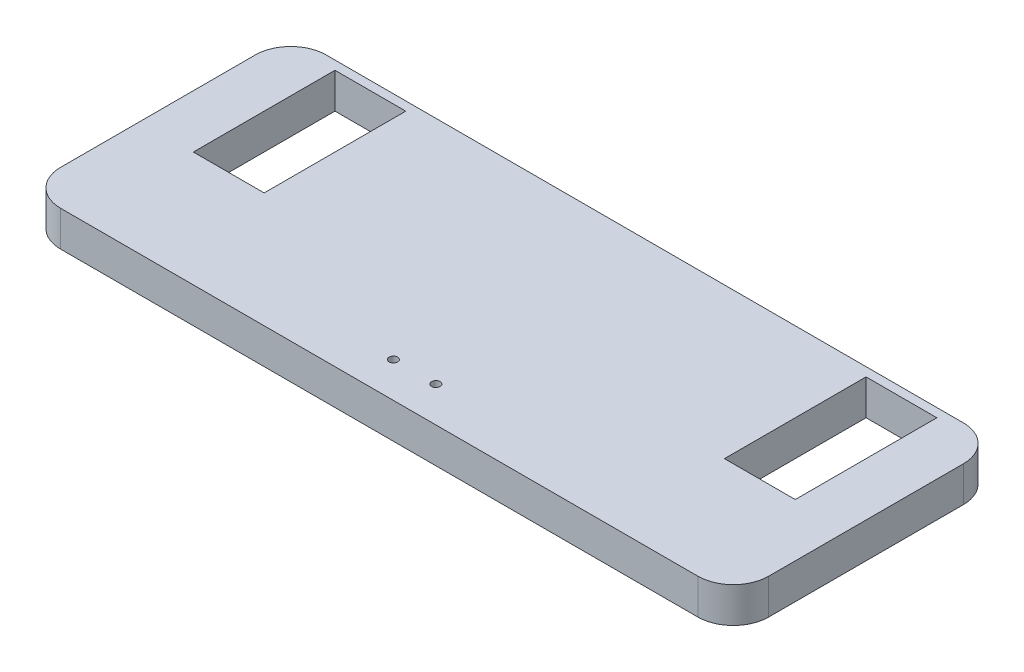
ISO-10303-21;
HEADER;
FILE_DESCRIPTION(('STEP AP214'),'2;1');
FILE_NAME('part.step','',(''),(''),'','','');
FILE_SCHEMA(('AUTOMOTIVE_DESIGN { 1 0 10303 214 1 1 1 1 }'));
ENDSEC;
DATA;
#1=APPLICATION_CONTEXT('core data for automotive mechanical design processes');
#2=APPLICATION_PROTOCOL_DEFINITION('international standard','automotive_design',2000,#1);
#3=PRODUCT_CONTEXT('',#1,'mechanical');
#4=PRODUCT('Part','Part','',(#3));
#5=PRODUCT_RELATED_PRODUCT_CATEGORY('part','',(#4));
#6=PRODUCT_DEFINITION_FORMATION('','',#4);
#7=PRODUCT_DEFINITION_CONTEXT('part definition',#1,'design');
#8=PRODUCT_DEFINITION('design','',#6,#7);
#9=PRODUCT_DEFINITION_SHAPE('','',#8);
#10=(LENGTH_UNIT() NAMED_UNIT(*) SI_UNIT(.MILLI.,.METRE.));
#11=(NAMED_UNIT(*) PLANE_ANGLE_UNIT() SI_UNIT($,.RADIAN.));
#12=(NAMED_UNIT(*) SI_UNIT($,.STERADIAN.) SOLID_ANGLE_UNIT());
#13=UNCERTAINTY_MEASURE_WITH_UNIT(LENGTH_MEASURE(1.E-05),#10,'distance_accuracy_value','');
#14=(GEOMETRIC_REPRESENTATION_CONTEXT(3) GLOBAL_UNCERTAINTY_ASSIGNED_CONTEXT((#13)) GLOBAL_UNIT_ASSIGNED_CONTEXT((#10,
#11,#12)) REPRESENTATION_CONTEXT('',''));
#15=CARTESIAN_POINT('',(0.,0.,0.));
#16=DIRECTION('',(0.,0.,1.));
#17=DIRECTION('',(1.,0.,0.));
#18=AXIS2_PLACEMENT_3D('',#15,#16,#17);
#19=CARTESIAN_POINT('',(0.,10.,0.));
#20=DIRECTION('',(1.,0.,0.));
#21=DIRECTION('',(0.,0.,-1.));
#22=AXIS2_PLACEMENT_3D('',#19,#20,#21);
#23=PLANE('',#22);
#24=DIRECTION('',(0.,0.,1.));
#25=VECTOR('',#24,1.);
#26=CARTESIAN_POINT('',(0.,0.,0.));
#27=LINE('',#26,#25);
#28=CARTESIAN_POINT('',(0.,0.,-65.));
#29=VERTEX_POINT('',#28);
#30=CARTESIAN_POINT('',(0.,0.,-10.));
#31=VERTEX_POINT('',#30);
#32=EDGE_CURVE('E242',#29,#31,#27,.T.);
#33=ORIENTED_EDGE('',*,*,#32,.T.);
#34=DIRECTION('',(0.,-1.,0.));
#35=VECTOR('',#34,1.);
#36=CARTESIAN_POINT('',(0.,10.,-10.));
#37=LINE('',#36,#35);
#38=CARTESIAN_POINT('',(0.,10.,-10.));
#39=VERTEX_POINT('',#38);
#40=EDGE_CURVE('E317',#31,#39,#37,.F.);
#41=ORIENTED_EDGE('',*,*,#40,.T.);
#42=DIRECTION('',(0.,0.,1.));
#43=VECTOR('',#42,1.);
#44=CARTESIAN_POINT('',(0.,10.,0.));
#45=LINE('',#44,#43);
#46=CARTESIAN_POINT('',(0.,10.,-65.));
#47=VERTEX_POINT('',#46);
#48=EDGE_CURVE('E278',#47,#39,#45,.T.);
#49=ORIENTED_EDGE('',*,*,#48,.F.);
#50=DIRECTION('',(0.,-1.,0.));
#51=VECTOR('',#50,1.);
#52=CARTESIAN_POINT('',(0.,10.,-65.));
#53=LINE('',#52,#51);
#54=EDGE_CURVE('E314',#47,#29,#53,.T.);
#55=ORIENTED_EDGE('',*,*,#54,.T.);
#56=EDGE_LOOP('',(#33,#41,#49,#55));
#57=FACE_BOUND('',#56,.T.);
#58=ADVANCED_FACE('F37',(#57),#23,.F.);
#59=CARTESIAN_POINT('',(0.,10.,0.));
#60=DIRECTION('',(0.,0.,-1.));
#61=DIRECTION('',(-1.,0.,0.));
#62=AXIS2_PLACEMENT_3D('',#59,#60,#61);
#63=PLANE('',#62);
#64=DIRECTION('',(1.,0.,0.));
#65=VECTOR('',#64,1.);
#66=CARTESIAN_POINT('',(0.,10.,0.));
#67=LINE('',#66,#65);
#68=CARTESIAN_POINT('',(10.,10.,0.));
#69=VERTEX_POINT('',#68);
#70=CARTESIAN_POINT('',(190.,10.,0.));
#71=VERTEX_POINT('',#70);
#72=EDGE_CURVE('E281',#69,#71,#67,.T.);
#73=ORIENTED_EDGE('',*,*,#72,.F.);
#74=DIRECTION('',(0.,-1.,0.));
#75=VECTOR('',#74,1.);
#76=CARTESIAN_POINT('',(10.,10.,0.));
#77=LINE('',#76,#75);
#78=CARTESIAN_POINT('',(10.,0.,0.));
#79=VERTEX_POINT('',#78);
#80=EDGE_CURVE('E303',#69,#79,#77,.T.);
#81=ORIENTED_EDGE('',*,*,#80,.T.);
#82=DIRECTION('',(1.,0.,0.));
#83=VECTOR('',#82,1.);
#84=CARTESIAN_POINT('',(0.,0.,0.));
#85=LINE('',#84,#83);
#86=CARTESIAN_POINT('',(190.,0.,0.));
#87=VERTEX_POINT('',#86);
#88=EDGE_CURVE('E294',#79,#87,#85,.T.);
#89=ORIENTED_EDGE('',*,*,#88,.T.);
#90=DIRECTION('',(0.,-1.,0.));
#91=VECTOR('',#90,1.);
#92=CARTESIAN_POINT('',(190.,10.,0.));
#93=LINE('',#92,#91);
#94=EDGE_CURVE('E291',#87,#71,#93,.F.);
#95=ORIENTED_EDGE('',*,*,#94,.T.);
#96=EDGE_LOOP('',(#73,#81,#89,#95));
#97=FACE_BOUND('',#96,.T.);
#98=ADVANCED_FACE('F356',(#97),#63,.F.);
#99=CARTESIAN_POINT('',(200.,10.,0.));
#100=DIRECTION('',(-1.,0.,0.));
#101=DIRECTION('',(0.,0.,1.));
#102=AXIS2_PLACEMENT_3D('',#99,#100,#101);
#103=PLANE('',#102);
#104=DIRECTION('',(0.,0.,-1.));
#105=VECTOR('',#104,1.);
#106=CARTESIAN_POINT('',(200.,10.,0.));
#107=LINE('',#106,#105);
#108=CARTESIAN_POINT('',(200.,10.,-10.));
#109=VERTEX_POINT('',#108);
#110=CARTESIAN_POINT('',(200.,10.,-65.));
#111=VERTEX_POINT('',#110);
#112=EDGE_CURVE('E285',#109,#111,#107,.T.);
#113=ORIENTED_EDGE('',*,*,#112,.F.);
#114=DIRECTION('',(0.,-1.,0.));
#115=VECTOR('',#114,1.);
#116=CARTESIAN_POINT('',(200.,10.,-10.));
#117=LINE('',#116,#115);
#118=CARTESIAN_POINT('',(200.,0.,-10.));
#119=VERTEX_POINT('',#118);
#120=EDGE_CURVE('E329',#109,#119,#117,.T.);
#121=ORIENTED_EDGE('',*,*,#120,.T.);
#122=DIRECTION('',(0.,0.,-1.));
#123=VECTOR('',#122,1.);
#124=CARTESIAN_POINT('',(200.,0.,0.));
#125=LINE('',#124,#123);
#126=CARTESIAN_POINT('',(200.,0.,-65.));
#127=VERTEX_POINT('',#126);
#128=EDGE_CURVE('E297',#119,#127,#125,.T.);
#129=ORIENTED_EDGE('',*,*,#128,.T.);
#130=DIRECTION('',(0.,-1.,0.));
#131=VECTOR('',#130,1.);
#132=CARTESIAN_POINT('',(200.,10.,-65.));
#133=LINE('',#132,#131);
#134=EDGE_CURVE('E327',#127,#111,#133,.F.);
#135=ORIENTED_EDGE('',*,*,#134,.T.);
#136=EDGE_LOOP('',(#113,#121,#129,#135));
#137=FACE_BOUND('',#136,.T.);
#138=ADVANCED_FACE('F365',(#137),#103,.F.);
#139=CARTESIAN_POINT('',(0.,10.,-75.));
#140=DIRECTION('',(0.,0.,1.));
#141=DIRECTION('',(1.,0.,0.));
#142=AXIS2_PLACEMENT_3D('',#139,#140,#141);
#143=PLANE('',#142);
#144=DIRECTION('',(-1.,0.,0.));
#145=VECTOR('',#144,1.);
#146=CARTESIAN_POINT('',(0.,10.,-75.));
#147=LINE('',#146,#145);
#148=CARTESIAN_POINT('',(190.,10.,-75.));
#149=VERTEX_POINT('',#148);
#150=CARTESIAN_POINT('',(10.,10.,-75.));
#151=VERTEX_POINT('',#150);
#152=EDGE_CURVE('E288',#149,#151,#147,.T.);
#153=ORIENTED_EDGE('',*,*,#152,.F.);
#154=DIRECTION('',(0.,-1.,0.));
#155=VECTOR('',#154,1.);
#156=CARTESIAN_POINT('',(190.,10.,-75.));
#157=LINE('',#156,#155);
#158=CARTESIAN_POINT('',(190.,0.,-75.));
#159=VERTEX_POINT('',#158);
#160=EDGE_CURVE('E12',#149,#159,#157,.T.);
#161=ORIENTED_EDGE('',*,*,#160,.T.);
#162=DIRECTION('',(-1.,0.,0.));
#163=VECTOR('',#162,1.);
#164=CARTESIAN_POINT('',(0.,0.,-75.));
#165=LINE('',#164,#163);
#166=CARTESIAN_POINT('',(10.,0.,-75.));
#167=VERTEX_POINT('',#166);
#168=EDGE_CURVE('E282',#159,#167,#165,.T.);
#169=ORIENTED_EDGE('',*,*,#168,.T.);
#170=DIRECTION('',(0.,-1.,0.));
#171=VECTOR('',#170,1.);
#172=CARTESIAN_POINT('',(10.,10.,-75.));
#173=LINE('',#172,#171);
#174=EDGE_CURVE('E45',#167,#151,#173,.F.);
#175=ORIENTED_EDGE('',*,*,#174,.T.);
#176=EDGE_LOOP('',(#153,#161,#169,#175));
#177=FACE_BOUND('',#176,.T.);
#178=ADVANCED_FACE('F334',(#177),#143,.F.);
#179=CARTESIAN_POINT('',(0.,10.,0.));
#180=DIRECTION('',(0.,-1.,0.));
#181=DIRECTION('',(0.,0.,-1.));
#182=AXIS2_PLACEMENT_3D('',#179,#180,#181);
#183=PLANE('',#182);
#184=CARTESIAN_POINT('',(106.,10.,-9.99999999999999));
#185=DIRECTION('',(0.,-1.,0.));
#186=DIRECTION('',(0.,0.,-1.));
#187=AXIS2_PLACEMENT_3D('',#184,#185,#186);
#188=CIRCLE('',#187,1.19999999999999);
#189=CARTESIAN_POINT('',(106.,10.,-11.2));
#190=VERTEX_POINT('',#189);
#191=EDGE_CURVE('E605',#190,#190,#188,.T.);
#192=ORIENTED_EDGE('',*,*,#191,.T.);
#193=EDGE_LOOP('',(#192));
#194=FACE_BOUND('',#193,.T.);
#195=CARTESIAN_POINT('',(94.,10.,-9.99999999999999));
#196=DIRECTION('',(0.,-1.,0.));
#197=DIRECTION('',(0.,0.,-1.));
#198=AXIS2_PLACEMENT_3D('',#195,#196,#197);
#199=CIRCLE('',#198,1.19999999999999);
#200=CARTESIAN_POINT('',(94.,10.,-11.2));
#201=VERTEX_POINT('',#200);
#202=EDGE_CURVE('E200',#201,#201,#199,.T.);
#203=ORIENTED_EDGE('',*,*,#202,.T.);
#204=EDGE_LOOP('',(#203));
#205=FACE_BOUND('',#204,.T.);
#206=DIRECTION('',(1.,0.,0.));
#207=VECTOR('',#206,1.);
#208=CARTESIAN_POINT('',(15.,10.,-32.5));
#209=LINE('',#208,#207);
#210=CARTESIAN_POINT('',(15.,10.,-32.5));
#211=VERTEX_POINT('',#210);
#212=CARTESIAN_POINT('',(35.,10.,-32.5));
#213=VERTEX_POINT('',#212);
#214=EDGE_CURVE('E231',#211,#213,#209,.T.);
#215=ORIENTED_EDGE('',*,*,#214,.F.);
#216=DIRECTION('',(0.,0.,1.));
#217=VECTOR('',#216,1.);
#218=CARTESIAN_POINT('',(15.,10.,-32.5));
#219=LINE('',#218,#217);
#220=CARTESIAN_POINT('',(15.,10.,-72.5));
#221=VERTEX_POINT('',#220);
#222=EDGE_CURVE('E60',#221,#211,#219,.T.);
#223=ORIENTED_EDGE('',*,*,#222,.F.);
#224=DIRECTION('',(-1.,0.,0.));
#225=VECTOR('',#224,1.);
#226=CARTESIAN_POINT('',(15.,10.,-72.5));
#227=LINE('',#226,#225);
#228=CARTESIAN_POINT('',(35.,10.,-72.5));
#229=VERTEX_POINT('',#228);
#230=EDGE_CURVE('E220',#229,#221,#227,.T.);
#231=ORIENTED_EDGE('',*,*,#230,.F.);
#232=DIRECTION('',(0.,0.,-1.));
#233=VECTOR('',#232,1.);
#234=CARTESIAN_POINT('',(35.,10.,-32.5));
#235=LINE('',#234,#233);
#236=EDGE_CURVE('E235',#213,#229,#235,.T.);
#237=ORIENTED_EDGE('',*,*,#236,.F.);
#238=EDGE_LOOP('',(#215,#223,#231,#237));
#239=FACE_BOUND('',#238,.T.);
#240=DIRECTION('',(0.,0.,-1.));
#241=VECTOR('',#240,1.);
#242=CARTESIAN_POINT('',(185.,10.,-32.5));
#243=LINE('',#242,#241);
#244=CARTESIAN_POINT('',(185.,10.,-32.5));
#245=VERTEX_POINT('',#244);
#246=CARTESIAN_POINT('',(185.,10.,-72.5));
#247=VERTEX_POINT('',#246);
#248=EDGE_CURVE('E263',#245,#247,#243,.T.);
#249=ORIENTED_EDGE('',*,*,#248,.F.);
#250=DIRECTION('',(1.,0.,0.));
#251=VECTOR('',#250,1.);
#252=CARTESIAN_POINT('',(185.,10.,-32.5));
#253=LINE('',#252,#251);
#254=CARTESIAN_POINT('',(165.,10.,-32.5));
#255=VERTEX_POINT('',#254);
#256=EDGE_CURVE('E212',#255,#245,#253,.T.);
#257=ORIENTED_EDGE('',*,*,#256,.F.);
#258=DIRECTION('',(0.,0.,1.));
#259=VECTOR('',#258,1.);
#260=CARTESIAN_POINT('',(165.,10.,-32.5));
#261=LINE('',#260,#259);
#262=CARTESIAN_POINT('',(165.,10.,-72.5));
#263=VERTEX_POINT('',#262);
#264=EDGE_CURVE('E252',#263,#255,#261,.T.);
#265=ORIENTED_EDGE('',*,*,#264,.F.);
#266=DIRECTION('',(-1.,0.,0.));
#267=VECTOR('',#266,1.);
#268=CARTESIAN_POINT('',(185.,10.,-72.5));
#269=LINE('',#268,#267);
#270=EDGE_CURVE('E266',#247,#263,#269,.T.);
#271=ORIENTED_EDGE('',*,*,#270,.F.);
#272=EDGE_LOOP('',(#249,#257,#265,#271));
#273=FACE_BOUND('',#272,.T.);
#274=ORIENTED_EDGE('',*,*,#48,.T.);
#275=CARTESIAN_POINT('',(10.,10.,-10.));
#276=DIRECTION('',(0.,-1.,0.));
#277=DIRECTION('',(0.,0.,-1.));
#278=AXIS2_PLACEMENT_3D('',#275,#276,#277);
#279=CIRCLE('',#278,10.);
#280=EDGE_CURVE('E325',#39,#69,#279,.F.);
#281=ORIENTED_EDGE('',*,*,#280,.T.);
#282=ORIENTED_EDGE('',*,*,#72,.T.);
#283=CARTESIAN_POINT('',(190.,10.,-10.));
#284=DIRECTION('',(0.,-1.,0.));
#285=DIRECTION('',(0.,0.,-1.));
#286=AXIS2_PLACEMENT_3D('',#283,#284,#285);
#287=CIRCLE('',#286,10.);
#288=EDGE_CURVE('E323',#71,#109,#287,.F.);
#289=ORIENTED_EDGE('',*,*,#288,.T.);
#290=ORIENTED_EDGE('',*,*,#112,.T.);
#291=CARTESIAN_POINT('',(190.,10.,-65.));
#292=DIRECTION('',(0.,-1.,0.));
#293=DIRECTION('',(0.,0.,-1.));
#294=AXIS2_PLACEMENT_3D('',#291,#292,#293);
#295=CIRCLE('',#294,10.);
#296=EDGE_CURVE('E321',#111,#149,#295,.F.);
#297=ORIENTED_EDGE('',*,*,#296,.T.);
#298=ORIENTED_EDGE('',*,*,#152,.T.);
#299=CARTESIAN_POINT('',(10.,10.,-65.));
#300=DIRECTION('',(0.,-1.,0.));
#301=DIRECTION('',(0.,0.,-1.));
#302=AXIS2_PLACEMENT_3D('',#299,#300,#301);
#303=CIRCLE('',#302,10.);
#304=EDGE_CURVE('E319',#151,#47,#303,.F.);
#305=ORIENTED_EDGE('',*,*,#304,.T.);
#306=EDGE_LOOP('',(#274,#281,#282,#289,#290,#297,#298,#305));
#307=FACE_BOUND('',#306,.T.);
#308=ADVANCED_FACE('F340',(#194,#205,#239,#273,#307),#183,.F.);
#309=CARTESIAN_POINT('',(0.,0.,0.));
#310=DIRECTION('',(0.,-1.,0.));
#311=DIRECTION('',(0.,0.,-1.));
#312=AXIS2_PLACEMENT_3D('',#309,#310,#311);
#313=PLANE('',#312);
#314=DIRECTION('',(0.,0.,1.));
#315=VECTOR('',#314,1.);
#316=CARTESIAN_POINT('',(110.,0.,-4.99999999999999));
#317=LINE('',#316,#315);
#318=CARTESIAN_POINT('',(110.,0.,-15.));
#319=VERTEX_POINT('',#318);
#320=CARTESIAN_POINT('',(110.,0.,-4.99999999999999));
#321=VERTEX_POINT('',#320);
#322=EDGE_CURVE('E52',#319,#321,#317,.T.);
#323=ORIENTED_EDGE('',*,*,#322,.F.);
#324=DIRECTION('',(1.,0.,0.));
#325=VECTOR('',#324,1.);
#326=CARTESIAN_POINT('',(110.,0.,-15.));
#327=LINE('',#326,#325);
#328=CARTESIAN_POINT('',(90.,0.,-15.));
#329=VERTEX_POINT('',#328);
#330=EDGE_CURVE('E194',#329,#319,#327,.T.);
#331=ORIENTED_EDGE('',*,*,#330,.F.);
#332=DIRECTION('',(0.,0.,-1.));
#333=VECTOR('',#332,1.);
#334=CARTESIAN_POINT('',(90.,0.,-4.99999999999999));
#335=LINE('',#334,#333);
#336=CARTESIAN_POINT('',(90.,0.,-4.99999999999999));
#337=VERTEX_POINT('',#336);
#338=EDGE_CURVE('E197',#337,#329,#335,.T.);
#339=ORIENTED_EDGE('',*,*,#338,.F.);
#340=DIRECTION('',(-1.,0.,0.));
#341=VECTOR('',#340,1.);
#342=CARTESIAN_POINT('',(110.,0.,-4.99999999999999));
#343=LINE('',#342,#341);
#344=EDGE_CURVE('E206',#321,#337,#343,.T.);
#345=ORIENTED_EDGE('',*,*,#344,.F.);
#346=EDGE_LOOP('',(#323,#331,#339,#345));
#347=FACE_BOUND('',#346,.T.);
#348=DIRECTION('',(0.,0.,1.));
#349=VECTOR('',#348,1.);
#350=CARTESIAN_POINT('',(15.,0.,-32.5));
#351=LINE('',#350,#349);
#352=CARTESIAN_POINT('',(15.,0.,-72.5));
#353=VERTEX_POINT('',#352);
#354=CARTESIAN_POINT('',(15.,0.,-32.5));
#355=VERTEX_POINT('',#354);
#356=EDGE_CURVE('E216',#353,#355,#351,.T.);
#357=ORIENTED_EDGE('',*,*,#356,.T.);
#358=DIRECTION('',(1.,0.,0.));
#359=VECTOR('',#358,1.);
#360=CARTESIAN_POINT('',(15.,0.,-32.5));
#361=LINE('',#360,#359);
#362=CARTESIAN_POINT('',(35.,0.,-32.5));
#363=VERTEX_POINT('',#362);
#364=EDGE_CURVE('E219',#355,#363,#361,.T.);
#365=ORIENTED_EDGE('',*,*,#364,.T.);
#366=DIRECTION('',(0.,0.,-1.));
#367=VECTOR('',#366,1.);
#368=CARTESIAN_POINT('',(35.,0.,-32.5));
#369=LINE('',#368,#367);
#370=CARTESIAN_POINT('',(35.,0.,-72.5));
#371=VERTEX_POINT('',#370);
#372=EDGE_CURVE('E223',#363,#371,#369,.T.);
#373=ORIENTED_EDGE('',*,*,#372,.T.);
#374=DIRECTION('',(-1.,0.,0.));
#375=VECTOR('',#374,1.);
#376=CARTESIAN_POINT('',(15.,0.,-72.5));
#377=LINE('',#376,#375);
#378=EDGE_CURVE('E226',#371,#353,#377,.T.);
#379=ORIENTED_EDGE('',*,*,#378,.T.);
#380=EDGE_LOOP('',(#357,#365,#373,#379));
#381=FACE_BOUND('',#380,.T.);
#382=DIRECTION('',(1.,0.,0.));
#383=VECTOR('',#382,1.);
#384=CARTESIAN_POINT('',(185.,0.,-32.5));
#385=LINE('',#384,#383);
#386=CARTESIAN_POINT('',(165.,0.,-32.5));
#387=VERTEX_POINT('',#386);
#388=CARTESIAN_POINT('',(185.,0.,-32.5));
#389=VERTEX_POINT('',#388);
#390=EDGE_CURVE('E248',#387,#389,#385,.T.);
#391=ORIENTED_EDGE('',*,*,#390,.T.);
#392=DIRECTION('',(0.,0.,-1.));
#393=VECTOR('',#392,1.);
#394=CARTESIAN_POINT('',(185.,0.,-32.5));
#395=LINE('',#394,#393);
#396=CARTESIAN_POINT('',(185.,0.,-72.5));
#397=VERTEX_POINT('',#396);
#398=EDGE_CURVE('E251',#389,#397,#395,.T.);
#399=ORIENTED_EDGE('',*,*,#398,.T.);
#400=DIRECTION('',(-1.,0.,0.));
#401=VECTOR('',#400,1.);
#402=CARTESIAN_POINT('',(185.,0.,-72.5));
#403=LINE('',#402,#401);
#404=CARTESIAN_POINT('',(165.,0.,-72.5));
#405=VERTEX_POINT('',#404);
#406=EDGE_CURVE('E255',#397,#405,#403,.T.);
#407=ORIENTED_EDGE('',*,*,#406,.T.);
#408=DIRECTION('',(0.,0.,1.));
#409=VECTOR('',#408,1.);
#410=CARTESIAN_POINT('',(165.,0.,-32.5));
#411=LINE('',#410,#409);
#412=EDGE_CURVE('E258',#405,#387,#411,.T.);
#413=ORIENTED_EDGE('',*,*,#412,.T.);
#414=EDGE_LOOP('',(#391,#399,#407,#413));
#415=FACE_BOUND('',#414,.T.);
#416=ORIENTED_EDGE('',*,*,#88,.F.);
#417=CARTESIAN_POINT('',(10.,0.,-10.));
#418=DIRECTION('',(0.,-1.,0.));
#419=DIRECTION('',(0.,0.,-1.));
#420=AXIS2_PLACEMENT_3D('',#417,#418,#419);
#421=CIRCLE('',#420,10.);
#422=EDGE_CURVE('E312',#79,#31,#421,.T.);
#423=ORIENTED_EDGE('',*,*,#422,.T.);
#424=ORIENTED_EDGE('',*,*,#32,.F.);
#425=CARTESIAN_POINT('',(10.,0.,-65.));
#426=DIRECTION('',(0.,-1.,0.));
#427=DIRECTION('',(0.,0.,-1.));
#428=AXIS2_PLACEMENT_3D('',#425,#426,#427);
#429=CIRCLE('',#428,10.);
#430=EDGE_CURVE('E306',#29,#167,#429,.T.);
#431=ORIENTED_EDGE('',*,*,#430,.T.);
#432=ORIENTED_EDGE('',*,*,#168,.F.);
#433=CARTESIAN_POINT('',(190.,0.,-65.));
#434=DIRECTION('',(0.,-1.,0.));
#435=DIRECTION('',(0.,0.,-1.));
#436=AXIS2_PLACEMENT_3D('',#433,#434,#435);
#437=CIRCLE('',#436,10.);
#438=EDGE_CURVE('E308',#159,#127,#437,.T.);
#439=ORIENTED_EDGE('',*,*,#438,.T.);
#440=ORIENTED_EDGE('',*,*,#128,.F.);
#441=CARTESIAN_POINT('',(190.,0.,-10.));
#442=DIRECTION('',(0.,-1.,0.));
#443=DIRECTION('',(0.,0.,-1.));
#444=AXIS2_PLACEMENT_3D('',#441,#442,#443);
#445=CIRCLE('',#444,10.);
#446=EDGE_CURVE('E310',#119,#87,#445,.T.);
#447=ORIENTED_EDGE('',*,*,#446,.T.);
#448=EDGE_LOOP('',(#416,#423,#424,#431,#432,#439,#440,#447));
#449=FACE_BOUND('',#448,.T.);
#450=ADVANCED_FACE('F349',(#347,#381,#415,#449),#313,.T.);
#451=CARTESIAN_POINT('',(10.,10.,-10.));
#452=DIRECTION('',(0.,-1.,0.));
#453=DIRECTION('',(0.,0.,-1.));
#454=AXIS2_PLACEMENT_3D('',#451,#452,#453);
#455=CYLINDRICAL_SURFACE('',#454,10.);
#456=ORIENTED_EDGE('',*,*,#280,.F.);
#457=ORIENTED_EDGE('',*,*,#40,.F.);
#458=ORIENTED_EDGE('',*,*,#422,.F.);
#459=ORIENTED_EDGE('',*,*,#80,.F.);
#460=EDGE_LOOP('',(#456,#457,#458,#459));
#461=FACE_BOUND('',#460,.T.);
#462=ADVANCED_FACE('F353',(#461),#455,.T.);
#463=CARTESIAN_POINT('',(190.,10.,-10.));
#464=DIRECTION('',(0.,-1.,0.));
#465=DIRECTION('',(0.,0.,-1.));
#466=AXIS2_PLACEMENT_3D('',#463,#464,#465);
#467=CYLINDRICAL_SURFACE('',#466,10.);
#468=ORIENTED_EDGE('',*,*,#288,.F.);
#469=ORIENTED_EDGE('',*,*,#94,.F.);
#470=ORIENTED_EDGE('',*,*,#446,.F.);
#471=ORIENTED_EDGE('',*,*,#120,.F.);
#472=EDGE_LOOP('',(#468,#469,#470,#471));
#473=FACE_BOUND('',#472,.T.);
#474=ADVANCED_FACE('F362',(#473),#467,.T.);
#475=CARTESIAN_POINT('',(190.,10.,-65.));
#476=DIRECTION('',(0.,-1.,0.));
#477=DIRECTION('',(0.,0.,-1.));
#478=AXIS2_PLACEMENT_3D('',#475,#476,#477);
#479=CYLINDRICAL_SURFACE('',#478,10.);
#480=ORIENTED_EDGE('',*,*,#296,.F.);
#481=ORIENTED_EDGE('',*,*,#134,.F.);
#482=ORIENTED_EDGE('',*,*,#438,.F.);
#483=ORIENTED_EDGE('',*,*,#160,.F.);
#484=EDGE_LOOP('',(#480,#481,#482,#483));
#485=FACE_BOUND('',#484,.T.);
#486=ADVANCED_FACE('F368',(#485),#479,.T.);
#487=CARTESIAN_POINT('',(10.,10.,-65.));
#488=DIRECTION('',(0.,-1.,0.));
#489=DIRECTION('',(0.,0.,-1.));
#490=AXIS2_PLACEMENT_3D('',#487,#488,#489);
#491=CYLINDRICAL_SURFACE('',#490,10.);
#492=ORIENTED_EDGE('',*,*,#304,.F.);
#493=ORIENTED_EDGE('',*,*,#174,.F.);
#494=ORIENTED_EDGE('',*,*,#430,.F.);
#495=ORIENTED_EDGE('',*,*,#54,.F.);
#496=EDGE_LOOP('',(#492,#493,#494,#495));
#497=FACE_BOUND('',#496,.T.);
#498=ADVANCED_FACE('F39',(#497),#491,.T.);
#499=CARTESIAN_POINT('',(185.,0.,-32.5));
#500=DIRECTION('',(0.,0.,1.));
#501=DIRECTION('',(1.,0.,0.));
#502=AXIS2_PLACEMENT_3D('',#499,#500,#501);
#503=PLANE('',#502);
#504=ORIENTED_EDGE('',*,*,#256,.T.);
#505=DIRECTION('',(0.,1.,0.));
#506=VECTOR('',#505,1.);
#507=CARTESIAN_POINT('',(185.,0.,-32.5));
#508=LINE('',#507,#506);
#509=EDGE_CURVE('E261',#389,#245,#508,.T.);
#510=ORIENTED_EDGE('',*,*,#509,.F.);
#511=ORIENTED_EDGE('',*,*,#390,.F.);
#512=DIRECTION('',(0.,1.,0.));
#513=VECTOR('',#512,1.);
#514=CARTESIAN_POINT('',(165.,0.,-32.5));
#515=LINE('',#514,#513);
#516=EDGE_CURVE('E232',#387,#255,#515,.T.);
#517=ORIENTED_EDGE('',*,*,#516,.T.);
#518=EDGE_LOOP('',(#504,#510,#511,#517));
#519=FACE_BOUND('',#518,.T.);
#520=ADVANCED_FACE('F374',(#519),#503,.F.);
#521=CARTESIAN_POINT('',(165.,0.,-32.5));
#522=DIRECTION('',(-1.,0.,0.));
#523=DIRECTION('',(0.,0.,1.));
#524=AXIS2_PLACEMENT_3D('',#521,#522,#523);
#525=PLANE('',#524);
#526=ORIENTED_EDGE('',*,*,#264,.T.);
#527=ORIENTED_EDGE('',*,*,#516,.F.);
#528=ORIENTED_EDGE('',*,*,#412,.F.);
#529=DIRECTION('',(0.,1.,0.));
#530=VECTOR('',#529,1.);
#531=CARTESIAN_POINT('',(165.,0.,-72.5));
#532=LINE('',#531,#530);
#533=EDGE_CURVE('E272',#405,#263,#532,.T.);
#534=ORIENTED_EDGE('',*,*,#533,.T.);
#535=EDGE_LOOP('',(#526,#527,#528,#534));
#536=FACE_BOUND('',#535,.T.);
#537=ADVANCED_FACE('F481',(#536),#525,.F.);
#538=CARTESIAN_POINT('',(185.,0.,-72.5));
#539=DIRECTION('',(0.,0.,-1.));
#540=DIRECTION('',(-1.,0.,0.));
#541=AXIS2_PLACEMENT_3D('',#538,#539,#540);
#542=PLANE('',#541);
#543=ORIENTED_EDGE('',*,*,#270,.T.);
#544=ORIENTED_EDGE('',*,*,#533,.F.);
#545=ORIENTED_EDGE('',*,*,#406,.F.);
#546=DIRECTION('',(0.,1.,0.));
#547=VECTOR('',#546,1.);
#548=CARTESIAN_POINT('',(185.,0.,-72.5));
#549=LINE('',#548,#547);
#550=EDGE_CURVE('E274',#397,#247,#549,.T.);
#551=ORIENTED_EDGE('',*,*,#550,.T.);
#552=EDGE_LOOP('',(#543,#544,#545,#551));
#553=FACE_BOUND('',#552,.T.);
#554=ADVANCED_FACE('F484',(#553),#542,.F.);
#555=CARTESIAN_POINT('',(185.,0.,-32.5));
#556=DIRECTION('',(1.,0.,0.));
#557=DIRECTION('',(0.,0.,-1.));
#558=AXIS2_PLACEMENT_3D('',#555,#556,#557);
#559=PLANE('',#558);
#560=ORIENTED_EDGE('',*,*,#248,.T.);
#561=ORIENTED_EDGE('',*,*,#550,.F.);
#562=ORIENTED_EDGE('',*,*,#398,.F.);
#563=ORIENTED_EDGE('',*,*,#509,.T.);
#564=EDGE_LOOP('',(#560,#561,#562,#563));
#565=FACE_BOUND('',#564,.T.);
#566=ADVANCED_FACE('F480',(#565),#559,.F.);
#567=CARTESIAN_POINT('',(15.,0.,-32.5));
#568=DIRECTION('',(-1.,0.,0.));
#569=DIRECTION('',(0.,0.,1.));
#570=AXIS2_PLACEMENT_3D('',#567,#568,#569);
#571=PLANE('',#570);
#572=ORIENTED_EDGE('',*,*,#222,.T.);
#573=DIRECTION('',(0.,1.,0.));
#574=VECTOR('',#573,1.);
#575=CARTESIAN_POINT('',(15.,0.,-32.5));
#576=LINE('',#575,#574);
#577=EDGE_CURVE('E229',#355,#211,#576,.T.);
#578=ORIENTED_EDGE('',*,*,#577,.F.);
#579=ORIENTED_EDGE('',*,*,#356,.F.);
#580=DIRECTION('',(0.,1.,0.));
#581=VECTOR('',#580,1.);
#582=CARTESIAN_POINT('',(15.,0.,-72.5));
#583=LINE('',#582,#581);
#584=EDGE_CURVE('E240',#353,#221,#583,.T.);
#585=ORIENTED_EDGE('',*,*,#584,.T.);
#586=EDGE_LOOP('',(#572,#578,#579,#585));
#587=FACE_BOUND('',#586,.T.);
#588=ADVANCED_FACE('F470',(#587),#571,.F.);
#589=CARTESIAN_POINT('',(15.,0.,-72.5));
#590=DIRECTION('',(0.,0.,-1.));
#591=DIRECTION('',(-1.,0.,0.));
#592=AXIS2_PLACEMENT_3D('',#589,#590,#591);
#593=PLANE('',#592);
#594=ORIENTED_EDGE('',*,*,#230,.T.);
#595=ORIENTED_EDGE('',*,*,#584,.F.);
#596=ORIENTED_EDGE('',*,*,#378,.F.);
#597=DIRECTION('',(0.,1.,0.));
#598=VECTOR('',#597,1.);
#599=CARTESIAN_POINT('',(35.,0.,-72.5));
#600=LINE('',#599,#598);
#601=EDGE_CURVE('E243',#371,#229,#600,.T.);
#602=ORIENTED_EDGE('',*,*,#601,.T.);
#603=EDGE_LOOP('',(#594,#595,#596,#602));
#604=FACE_BOUND('',#603,.T.);
#605=ADVANCED_FACE('F466',(#604),#593,.F.);
#606=CARTESIAN_POINT('',(35.,0.,-32.5));
#607=DIRECTION('',(1.,0.,0.));
#608=DIRECTION('',(0.,0.,-1.));
#609=AXIS2_PLACEMENT_3D('',#606,#607,#608);
#610=PLANE('',#609);
#611=ORIENTED_EDGE('',*,*,#236,.T.);
#612=ORIENTED_EDGE('',*,*,#601,.F.);
#613=ORIENTED_EDGE('',*,*,#372,.F.);
#614=DIRECTION('',(0.,1.,0.));
#615=VECTOR('',#614,1.);
#616=CARTESIAN_POINT('',(35.,0.,-32.5));
#617=LINE('',#616,#615);
#618=EDGE_CURVE('E245',#363,#213,#617,.T.);
#619=ORIENTED_EDGE('',*,*,#618,.T.);
#620=EDGE_LOOP('',(#611,#612,#613,#619));
#621=FACE_BOUND('',#620,.T.);
#622=ADVANCED_FACE('F469',(#621),#610,.F.);
#623=CARTESIAN_POINT('',(15.,0.,-32.5));
#624=DIRECTION('',(0.,0.,1.));
#625=DIRECTION('',(1.,0.,0.));
#626=AXIS2_PLACEMENT_3D('',#623,#624,#625);
#627=PLANE('',#626);
#628=ORIENTED_EDGE('',*,*,#214,.T.);
#629=ORIENTED_EDGE('',*,*,#618,.F.);
#630=ORIENTED_EDGE('',*,*,#364,.F.);
#631=ORIENTED_EDGE('',*,*,#577,.T.);
#632=EDGE_LOOP('',(#628,#629,#630,#631));
#633=FACE_BOUND('',#632,.T.);
#634=ADVANCED_FACE('F465',(#633),#627,.F.);
#635=CARTESIAN_POINT('',(110.,1.,-4.99999999999999));
#636=DIRECTION('',(1.,0.,0.));
#637=DIRECTION('',(0.,0.,-1.));
#638=AXIS2_PLACEMENT_3D('',#635,#636,#637);
#639=PLANE('',#638);
#640=ORIENTED_EDGE('',*,*,#322,.T.);
#641=DIRECTION('',(0.,-1.,0.));
#642=VECTOR('',#641,1.);
#643=CARTESIAN_POINT('',(110.,1.,-4.99999999999999));
#644=LINE('',#643,#642);
#645=CARTESIAN_POINT('',(110.,1.,-4.99999999999999));
#646=VERTEX_POINT('',#645);
#647=EDGE_CURVE('E172',#646,#321,#644,.T.);
#648=ORIENTED_EDGE('',*,*,#647,.F.);
#649=DIRECTION('',(0.,0.,1.));
#650=VECTOR('',#649,1.);
#651=CARTESIAN_POINT('',(110.,1.,-4.99999999999999));
#652=LINE('',#651,#650);
#653=CARTESIAN_POINT('',(110.,1.,-15.));
#654=VERTEX_POINT('',#653);
#655=EDGE_CURVE('E176',#654,#646,#652,.T.);
#656=ORIENTED_EDGE('',*,*,#655,.F.);
#657=DIRECTION('',(0.,-1.,0.));
#658=VECTOR('',#657,1.);
#659=CARTESIAN_POINT('',(110.,1.,-15.));
#660=LINE('',#659,#658);
#661=EDGE_CURVE('E210',#654,#319,#660,.T.);
#662=ORIENTED_EDGE('',*,*,#661,.T.);
#663=EDGE_LOOP('',(#640,#648,#656,#662));
#664=FACE_BOUND('',#663,.T.);
#665=ADVANCED_FACE('F174',(#664),#639,.F.);
#666=CARTESIAN_POINT('',(110.,1.,-15.));
#667=DIRECTION('',(0.,0.,-1.));
#668=DIRECTION('',(-1.,0.,0.));
#669=AXIS2_PLACEMENT_3D('',#666,#667,#668);
#670=PLANE('',#669);
#671=ORIENTED_EDGE('',*,*,#330,.T.);
#672=ORIENTED_EDGE('',*,*,#661,.F.);
#673=DIRECTION('',(1.,0.,0.));
#674=VECTOR('',#673,1.);
#675=CARTESIAN_POINT('',(110.,1.,-15.));
#676=LINE('',#675,#674);
#677=CARTESIAN_POINT('',(90.,1.,-15.));
#678=VERTEX_POINT('',#677);
#679=EDGE_CURVE('E182',#678,#654,#676,.T.);
#680=ORIENTED_EDGE('',*,*,#679,.F.);
#681=DIRECTION('',(0.,-1.,0.));
#682=VECTOR('',#681,1.);
#683=CARTESIAN_POINT('',(90.,1.,-15.));
#684=LINE('',#683,#682);
#685=EDGE_CURVE('E213',#678,#329,#684,.T.);
#686=ORIENTED_EDGE('',*,*,#685,.T.);
#687=EDGE_LOOP('',(#671,#672,#680,#686));
#688=FACE_BOUND('',#687,.T.);
#689=ADVANCED_FACE('F454',(#688),#670,.F.);
#690=CARTESIAN_POINT('',(90.,1.,-4.99999999999999));
#691=DIRECTION('',(-1.,0.,0.));
#692=DIRECTION('',(0.,0.,1.));
#693=AXIS2_PLACEMENT_3D('',#690,#691,#692);
#694=PLANE('',#693);
#695=ORIENTED_EDGE('',*,*,#338,.T.);
#696=ORIENTED_EDGE('',*,*,#685,.F.);
#697=DIRECTION('',(0.,0.,-1.));
#698=VECTOR('',#697,1.);
#699=CARTESIAN_POINT('',(90.,1.,-4.99999999999999));
#700=LINE('',#699,#698);
#701=CARTESIAN_POINT('',(90.,1.,-4.99999999999999));
#702=VERTEX_POINT('',#701);
#703=EDGE_CURVE('E190',#702,#678,#700,.T.);
#704=ORIENTED_EDGE('',*,*,#703,.F.);
#705=DIRECTION('',(0.,-1.,0.));
#706=VECTOR('',#705,1.);
#707=CARTESIAN_POINT('',(90.,1.,-4.99999999999999));
#708=LINE('',#707,#706);
#709=EDGE_CURVE('E181',#702,#337,#708,.T.);
#710=ORIENTED_EDGE('',*,*,#709,.T.);
#711=EDGE_LOOP('',(#695,#696,#704,#710));
#712=FACE_BOUND('',#711,.T.);
#713=ADVANCED_FACE('F457',(#712),#694,.F.);
#714=CARTESIAN_POINT('',(110.,1.,-4.99999999999999));
#715=DIRECTION('',(0.,0.,1.));
#716=DIRECTION('',(1.,0.,0.));
#717=AXIS2_PLACEMENT_3D('',#714,#715,#716);
#718=PLANE('',#717);
#719=ORIENTED_EDGE('',*,*,#344,.T.);
#720=ORIENTED_EDGE('',*,*,#709,.F.);
#721=DIRECTION('',(-1.,0.,0.));
#722=VECTOR('',#721,1.);
#723=CARTESIAN_POINT('',(110.,1.,-4.99999999999999));
#724=LINE('',#723,#722);
#725=EDGE_CURVE('E185',#646,#702,#724,.T.);
#726=ORIENTED_EDGE('',*,*,#725,.F.);
#727=ORIENTED_EDGE('',*,*,#647,.T.);
#728=EDGE_LOOP('',(#719,#720,#726,#727));
#729=FACE_BOUND('',#728,.T.);
#730=ADVANCED_FACE('F186',(#729),#718,.F.);
#731=CARTESIAN_POINT('',(0.,1.,0.));
#732=DIRECTION('',(0.,1.,0.));
#733=DIRECTION('',(0.,0.,1.));
#734=AXIS2_PLACEMENT_3D('',#731,#732,#733);
#735=PLANE('',#734);
#736=CARTESIAN_POINT('',(106.,1.,-9.99999999999999));
#737=DIRECTION('',(0.,-1.,0.));
#738=DIRECTION('',(0.,0.,-1.));
#739=AXIS2_PLACEMENT_3D('',#736,#737,#738);
#740=CIRCLE('',#739,1.19999999999999);
#741=CARTESIAN_POINT('',(106.,1.,-11.2));
#742=VERTEX_POINT('',#741);
#743=EDGE_CURVE('E608',#742,#742,#740,.T.);
#744=ORIENTED_EDGE('',*,*,#743,.F.);
#745=EDGE_LOOP('',(#744));
#746=FACE_BOUND('',#745,.T.);
#747=CARTESIAN_POINT('',(94.,1.,-9.99999999999999));
#748=DIRECTION('',(0.,-1.,0.));
#749=DIRECTION('',(0.,0.,-1.));
#750=AXIS2_PLACEMENT_3D('',#747,#748,#749);
#751=CIRCLE('',#750,1.19999999999999);
#752=CARTESIAN_POINT('',(94.,1.,-11.2));
#753=VERTEX_POINT('',#752);
#754=EDGE_CURVE('E610',#753,#753,#751,.T.);
#755=ORIENTED_EDGE('',*,*,#754,.F.);
#756=EDGE_LOOP('',(#755));
#757=FACE_BOUND('',#756,.T.);
#758=ORIENTED_EDGE('',*,*,#655,.T.);
#759=ORIENTED_EDGE('',*,*,#725,.T.);
#760=ORIENTED_EDGE('',*,*,#703,.T.);
#761=ORIENTED_EDGE('',*,*,#679,.T.);
#762=EDGE_LOOP('',(#758,#759,#760,#761));
#763=FACE_BOUND('',#762,.T.);
#764=ADVANCED_FACE('F192',(#746,#757,#763),#735,.F.);
#765=CARTESIAN_POINT('',(94.,1.,-9.99999999999999));
#766=DIRECTION('',(0.,-1.,0.));
#767=DIRECTION('',(0.,0.,-1.));
#768=AXIS2_PLACEMENT_3D('',#765,#766,#767);
#769=CYLINDRICAL_SURFACE('',#768,1.19999999999999);
#770=ORIENTED_EDGE('',*,*,#202,.F.);
#771=EDGE_LOOP('',(#770));
#772=FACE_BOUND('',#771,.T.);
#773=ORIENTED_EDGE('',*,*,#754,.T.);
#774=EDGE_LOOP('',(#773));
#775=FACE_BOUND('',#774,.T.);
#776=ADVANCED_FACE('F427',(#772,#775),#769,.F.);
#777=CARTESIAN_POINT('',(106.,1.,-9.99999999999999));
#778=DIRECTION('',(0.,-1.,0.));
#779=DIRECTION('',(0.,0.,-1.));
#780=AXIS2_PLACEMENT_3D('',#777,#778,#779);
#781=CYLINDRICAL_SURFACE('',#780,1.19999999999999);
#782=ORIENTED_EDGE('',*,*,#191,.F.);
#783=EDGE_LOOP('',(#782));
#784=FACE_BOUND('',#783,.T.);
#785=ORIENTED_EDGE('',*,*,#743,.T.);
#786=EDGE_LOOP('',(#785));
#787=FACE_BOUND('',#786,.T.);
#788=ADVANCED_FACE('F437',(#784,#787),#781,.F.);
#789=CLOSED_SHELL('',(#58,#98,#138,#178,#308,#450,#462,#474,#486,#498,#520,#537,#554,#566,#588,
#605,#622,#634,#665,#689,#713,#730,#764,#776,#788));
#790=MANIFOLD_SOLID_BREP('B2',#789);
#791=ADVANCED_BREP_SHAPE_REPRESENTATION('',(#18,#790),#14);
#792=SHAPE_DEFINITION_REPRESENTATION(#9,#791);
ENDSEC;
END-ISO-10303-21;
